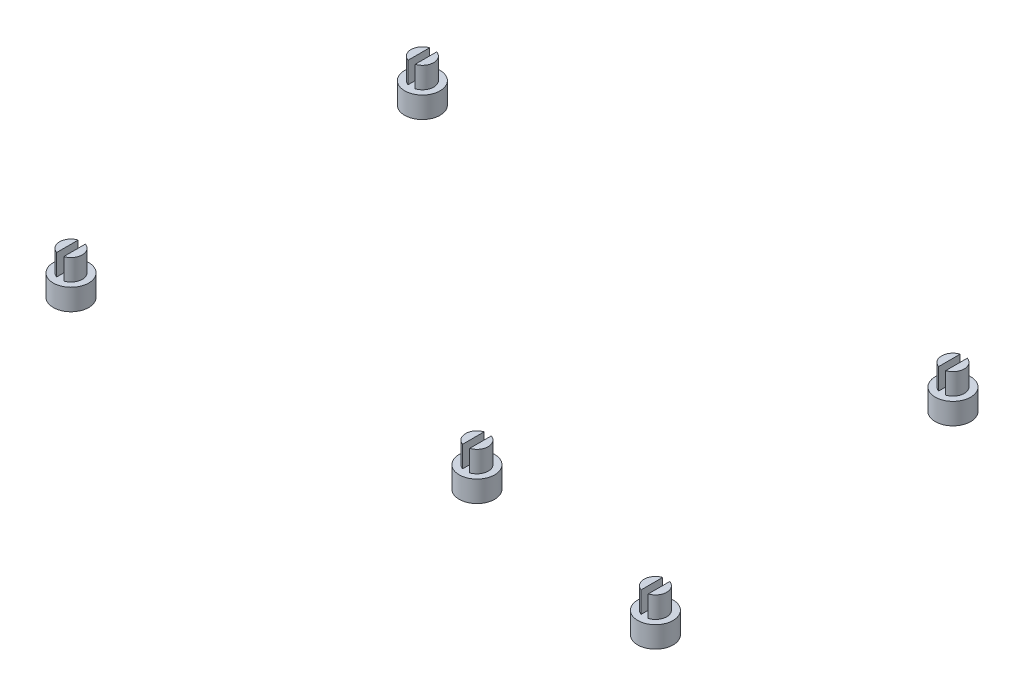
ISO-10303-21;
HEADER;
FILE_DESCRIPTION(('STEP AP214'),'2;1');
FILE_NAME('part.step','',(''),(''),'','','');
FILE_SCHEMA(('AUTOMOTIVE_DESIGN { 1 0 10303 214 1 1 1 1 }'));
ENDSEC;
DATA;
#1=APPLICATION_CONTEXT('core data for automotive mechanical design processes');
#2=APPLICATION_PROTOCOL_DEFINITION('international standard','automotive_design',2000,#1);
#3=PRODUCT_CONTEXT('',#1,'mechanical');
#4=PRODUCT('Part','Part','',(#3));
#5=PRODUCT_RELATED_PRODUCT_CATEGORY('part','',(#4));
#6=PRODUCT_DEFINITION_FORMATION('','',#4);
#7=PRODUCT_DEFINITION_CONTEXT('part definition',#1,'design');
#8=PRODUCT_DEFINITION('design','',#6,#7);
#9=PRODUCT_DEFINITION_SHAPE('','',#8);
#10=(LENGTH_UNIT() NAMED_UNIT(*) SI_UNIT(.MILLI.,.METRE.));
#11=(NAMED_UNIT(*) PLANE_ANGLE_UNIT() SI_UNIT($,.RADIAN.));
#12=(NAMED_UNIT(*) SI_UNIT($,.STERADIAN.) SOLID_ANGLE_UNIT());
#13=UNCERTAINTY_MEASURE_WITH_UNIT(LENGTH_MEASURE(1.E-05),#10,'distance_accuracy_value','');
#14=(GEOMETRIC_REPRESENTATION_CONTEXT(3) GLOBAL_UNCERTAINTY_ASSIGNED_CONTEXT((#13)) GLOBAL_UNIT_ASSIGNED_CONTEXT((#10,
#11,#12)) REPRESENTATION_CONTEXT('',''));
#15=CARTESIAN_POINT('',(0.,0.,0.));
#16=DIRECTION('',(0.,0.,1.));
#17=DIRECTION('',(1.,0.,0.));
#18=AXIS2_PLACEMENT_3D('',#15,#16,#17);
#19=CARTESIAN_POINT('',(-18.9293474696962,28.0298730206955,63.6915116533311));
#20=DIRECTION('',(0.,1.,0.));
#21=DIRECTION('',(0.,0.,1.));
#22=AXIS2_PLACEMENT_3D('',#19,#20,#21);
#23=PLANE('',#22);
#24=CARTESIAN_POINT('',(-18.9293474696962,28.0298730206955,63.6915116533311));
#25=DIRECTION('',(0.,1.,0.));
#26=DIRECTION('',(0.,0.,1.));
#27=AXIS2_PLACEMENT_3D('',#24,#25,#26);
#28=CIRCLE('',#27,2.5);
#29=CARTESIAN_POINT('',(-18.9293474696962,28.0298730206955,66.1915116533311));
#30=VERTEX_POINT('',#29);
#31=EDGE_CURVE('E59',#30,#30,#28,.T.);
#32=ORIENTED_EDGE('',*,*,#31,.T.);
#33=EDGE_LOOP('',(#32));
#34=FACE_BOUND('',#33,.T.);
#35=DIRECTION('',(0.,0.,-1.));
#36=VECTOR('',#35,1.);
#37=CARTESIAN_POINT('',(-18.4293474696962,28.0298730206955,15.3915116533311));
#38=LINE('',#37,#36);
#39=CARTESIAN_POINT('',(-18.4293474696962,28.0298730206955,65.2113800686881));
#40=VERTEX_POINT('',#39);
#41=CARTESIAN_POINT('',(-18.4293474696962,28.0298730206955,62.171643237974));
#42=VERTEX_POINT('',#41);
#43=EDGE_CURVE('E77',#40,#42,#38,.T.);
#44=ORIENTED_EDGE('',*,*,#43,.T.);
#45=CARTESIAN_POINT('',(-18.9293474696962,28.0298730206955,63.6915116533311));
#46=DIRECTION('',(0.,1.,0.));
#47=DIRECTION('',(0.,0.,1.));
#48=AXIS2_PLACEMENT_3D('',#45,#46,#47);
#49=CIRCLE('',#48,1.6);
#50=EDGE_CURVE('E111',#40,#42,#49,.T.);
#51=ORIENTED_EDGE('',*,*,#50,.F.);
#52=EDGE_LOOP('',(#44,#51));
#53=FACE_BOUND('',#52,.T.);
#54=DIRECTION('',(0.,0.,-1.));
#55=VECTOR('',#54,1.);
#56=CARTESIAN_POINT('',(-19.4293474696962,28.0298730206955,15.3915116533311));
#57=LINE('',#56,#55);
#58=CARTESIAN_POINT('',(-19.4293474696962,28.0298730206955,65.2113800686881));
#59=VERTEX_POINT('',#58);
#60=CARTESIAN_POINT('',(-19.4293474696962,28.0298730206955,62.171643237974));
#61=VERTEX_POINT('',#60);
#62=EDGE_CURVE('E108',#59,#61,#57,.T.);
#63=ORIENTED_EDGE('',*,*,#62,.F.);
#64=CARTESIAN_POINT('',(-18.9293474696962,28.0298730206955,63.6915116533311));
#65=DIRECTION('',(0.,1.,0.));
#66=DIRECTION('',(0.,0.,1.));
#67=AXIS2_PLACEMENT_3D('',#64,#65,#66);
#68=CIRCLE('',#67,1.6);
#69=EDGE_CURVE('E70',#61,#59,#68,.T.);
#70=ORIENTED_EDGE('',*,*,#69,.F.);
#71=EDGE_LOOP('',(#63,#70));
#72=FACE_BOUND('',#71,.T.);
#73=ADVANCED_FACE('F56',(#34,#53,#72),#23,.T.);
#74=CARTESIAN_POINT('',(-18.9293474696962,28.0298730206955,63.6915116533311));
#75=DIRECTION('',(0.,-1.,0.));
#76=DIRECTION('',(0.,0.,-1.));
#77=AXIS2_PLACEMENT_3D('',#74,#75,#76);
#78=CYLINDRICAL_SURFACE('',#77,2.5);
#79=ORIENTED_EDGE('',*,*,#31,.F.);
#80=EDGE_LOOP('',(#79));
#81=FACE_BOUND('',#80,.T.);
#82=CARTESIAN_POINT('',(-18.9293474696962,25.0298730206955,63.6915116533311));
#83=DIRECTION('',(0.,1.,0.));
#84=DIRECTION('',(0.,0.,1.));
#85=AXIS2_PLACEMENT_3D('',#82,#83,#84);
#86=CIRCLE('',#85,2.5);
#87=CARTESIAN_POINT('',(-18.9293474696962,25.0298730206955,66.1915116533311));
#88=VERTEX_POINT('',#87);
#89=EDGE_CURVE('E12',#88,#88,#86,.T.);
#90=ORIENTED_EDGE('',*,*,#89,.T.);
#91=EDGE_LOOP('',(#90));
#92=FACE_BOUND('',#91,.T.);
#93=ADVANCED_FACE('F134',(#81,#92),#78,.T.);
#94=CARTESIAN_POINT('',(-18.9293474696962,25.0298730206955,63.6915116533311));
#95=DIRECTION('',(0.,1.,0.));
#96=DIRECTION('',(0.,0.,1.));
#97=AXIS2_PLACEMENT_3D('',#94,#95,#96);
#98=PLANE('',#97);
#99=ORIENTED_EDGE('',*,*,#89,.F.);
#100=EDGE_LOOP('',(#99));
#101=FACE_BOUND('',#100,.T.);
#102=ADVANCED_FACE('F137',(#101),#98,.F.);
#103=CARTESIAN_POINT('',(-18.9293474696962,31.0298730206955,63.6915116533311));
#104=DIRECTION('',(0.,-1.,0.));
#105=DIRECTION('',(0.,0.,-1.));
#106=AXIS2_PLACEMENT_3D('',#103,#104,#105);
#107=CYLINDRICAL_SURFACE('',#106,1.6);
#108=ORIENTED_EDGE('',*,*,#50,.T.);
#109=DIRECTION('',(0.,-1.,0.));
#110=VECTOR('',#109,1.);
#111=CARTESIAN_POINT('',(-18.4293474696962,31.0298730206955,62.171643237974));
#112=LINE('',#111,#110);
#113=CARTESIAN_POINT('',(-18.4293474696962,31.0298730206955,62.171643237974));
#114=VERTEX_POINT('',#113);
#115=EDGE_CURVE('E127',#114,#42,#112,.T.);
#116=ORIENTED_EDGE('',*,*,#115,.F.);
#117=CARTESIAN_POINT('',(-18.9293474696962,31.0298730206955,63.6915116533311));
#118=DIRECTION('',(0.,1.,0.));
#119=DIRECTION('',(0.,0.,1.));
#120=AXIS2_PLACEMENT_3D('',#117,#118,#119);
#121=CIRCLE('',#120,1.6);
#122=CARTESIAN_POINT('',(-18.4293474696962,31.0298730206955,65.2113800686881));
#123=VERTEX_POINT('',#122);
#124=EDGE_CURVE('E118',#123,#114,#121,.T.);
#125=ORIENTED_EDGE('',*,*,#124,.F.);
#126=DIRECTION('',(0.,-1.,0.));
#127=VECTOR('',#126,1.);
#128=CARTESIAN_POINT('',(-18.4293474696962,31.0298730206955,65.2113800686881));
#129=LINE('',#128,#127);
#130=EDGE_CURVE('E122',#123,#40,#129,.T.);
#131=ORIENTED_EDGE('',*,*,#130,.T.);
#132=EDGE_LOOP('',(#108,#116,#125,#131));
#133=FACE_BOUND('',#132,.T.);
#134=ADVANCED_FACE('F142',(#133),#107,.T.);
#135=CARTESIAN_POINT('',(-18.4293474696962,31.0298730206955,15.3915116533311));
#136=DIRECTION('',(-1.,0.,0.));
#137=DIRECTION('',(0.,0.,1.));
#138=AXIS2_PLACEMENT_3D('',#135,#136,#137);
#139=PLANE('',#138);
#140=ORIENTED_EDGE('',*,*,#43,.F.);
#141=ORIENTED_EDGE('',*,*,#130,.F.);
#142=DIRECTION('',(0.,0.,-1.));
#143=VECTOR('',#142,1.);
#144=CARTESIAN_POINT('',(-18.4293474696962,31.0298730206955,15.3915116533311));
#145=LINE('',#144,#143);
#146=EDGE_CURVE('E120',#123,#114,#145,.T.);
#147=ORIENTED_EDGE('',*,*,#146,.T.);
#148=ORIENTED_EDGE('',*,*,#115,.T.);
#149=EDGE_LOOP('',(#140,#141,#147,#148));
#150=FACE_BOUND('',#149,.T.);
#151=ADVANCED_FACE('F147',(#150),#139,.T.);
#152=CARTESIAN_POINT('',(-18.9293474696962,31.0298730206955,63.6915116533311));
#153=DIRECTION('',(0.,1.,0.));
#154=DIRECTION('',(0.,0.,1.));
#155=AXIS2_PLACEMENT_3D('',#152,#153,#154);
#156=PLANE('',#155);
#157=ORIENTED_EDGE('',*,*,#124,.T.);
#158=ORIENTED_EDGE('',*,*,#146,.F.);
#159=EDGE_LOOP('',(#157,#158));
#160=FACE_BOUND('',#159,.T.);
#161=ADVANCED_FACE('F164',(#160),#156,.T.);
#162=CARTESIAN_POINT('',(-18.9293474696962,31.0298730206955,63.6915116533311));
#163=DIRECTION('',(0.,-1.,0.));
#164=DIRECTION('',(0.,0.,-1.));
#165=AXIS2_PLACEMENT_3D('',#162,#163,#164);
#166=CYLINDRICAL_SURFACE('',#165,1.6);
#167=ORIENTED_EDGE('',*,*,#69,.T.);
#168=DIRECTION('',(0.,-1.,0.));
#169=VECTOR('',#168,1.);
#170=CARTESIAN_POINT('',(-19.4293474696962,31.0298730206955,65.2113800686881));
#171=LINE('',#170,#169);
#172=CARTESIAN_POINT('',(-19.4293474696962,31.0298730206955,65.2113800686881));
#173=VERTEX_POINT('',#172);
#174=EDGE_CURVE('E100',#173,#59,#171,.T.);
#175=ORIENTED_EDGE('',*,*,#174,.F.);
#176=CARTESIAN_POINT('',(-18.9293474696962,31.0298730206955,63.6915116533311));
#177=DIRECTION('',(0.,1.,0.));
#178=DIRECTION('',(0.,0.,1.));
#179=AXIS2_PLACEMENT_3D('',#176,#177,#178);
#180=CIRCLE('',#179,1.6);
#181=CARTESIAN_POINT('',(-19.4293474696962,31.0298730206955,62.171643237974));
#182=VERTEX_POINT('',#181);
#183=EDGE_CURVE('E105',#182,#173,#180,.T.);
#184=ORIENTED_EDGE('',*,*,#183,.F.);
#185=DIRECTION('',(0.,-1.,0.));
#186=VECTOR('',#185,1.);
#187=CARTESIAN_POINT('',(-19.4293474696962,31.0298730206955,62.171643237974));
#188=LINE('',#187,#186);
#189=EDGE_CURVE('E102',#182,#61,#188,.T.);
#190=ORIENTED_EDGE('',*,*,#189,.T.);
#191=EDGE_LOOP('',(#167,#175,#184,#190));
#192=FACE_BOUND('',#191,.T.);
#193=ADVANCED_FACE('F110',(#192),#166,.T.);
#194=CARTESIAN_POINT('',(-19.4293474696962,31.0298730206955,15.3915116533311));
#195=DIRECTION('',(-1.,0.,0.));
#196=DIRECTION('',(0.,0.,1.));
#197=AXIS2_PLACEMENT_3D('',#194,#195,#196);
#198=PLANE('',#197);
#199=ORIENTED_EDGE('',*,*,#62,.T.);
#200=ORIENTED_EDGE('',*,*,#189,.F.);
#201=DIRECTION('',(0.,0.,-1.));
#202=VECTOR('',#201,1.);
#203=CARTESIAN_POINT('',(-19.4293474696962,31.0298730206955,15.3915116533311));
#204=LINE('',#203,#202);
#205=EDGE_CURVE('E97',#173,#182,#204,.T.);
#206=ORIENTED_EDGE('',*,*,#205,.F.);
#207=ORIENTED_EDGE('',*,*,#174,.T.);
#208=EDGE_LOOP('',(#199,#200,#206,#207));
#209=FACE_BOUND('',#208,.T.);
#210=ADVANCED_FACE('F99',(#209),#198,.F.);
#211=CARTESIAN_POINT('',(-18.9293474696962,31.0298730206955,63.6915116533311));
#212=DIRECTION('',(0.,1.,0.));
#213=DIRECTION('',(0.,0.,1.));
#214=AXIS2_PLACEMENT_3D('',#211,#212,#213);
#215=PLANE('',#214);
#216=ORIENTED_EDGE('',*,*,#183,.T.);
#217=ORIENTED_EDGE('',*,*,#205,.T.);
#218=EDGE_LOOP('',(#216,#217));
#219=FACE_BOUND('',#218,.T.);
#220=ADVANCED_FACE('F107',(#219),#215,.T.);
#221=CLOSED_SHELL('',(#73,#93,#102,#134,#151,#161,#193,#210,#220));
#222=MANIFOLD_SOLID_BREP('B2',#221);
#223=CARTESIAN_POINT('',(33.1706525303038,28.0298730206955,58.4915116533311));
#224=DIRECTION('',(0.,1.,0.));
#225=DIRECTION('',(0.,0.,1.));
#226=AXIS2_PLACEMENT_3D('',#223,#224,#225);
#227=PLANE('',#226);
#228=CARTESIAN_POINT('',(33.1706525303038,28.0298730206955,58.4915116533311));
#229=DIRECTION('',(0.,1.,0.));
#230=DIRECTION('',(0.,0.,1.));
#231=AXIS2_PLACEMENT_3D('',#228,#229,#230);
#232=CIRCLE('',#231,2.5);
#233=CARTESIAN_POINT('',(33.1706525303038,28.0298730206955,60.9915116533311));
#234=VERTEX_POINT('',#233);
#235=EDGE_CURVE('E234',#234,#234,#232,.T.);
#236=ORIENTED_EDGE('',*,*,#235,.T.);
#237=EDGE_LOOP('',(#236));
#238=FACE_BOUND('',#237,.T.);
#239=DIRECTION('',(0.,0.,-1.));
#240=VECTOR('',#239,1.);
#241=CARTESIAN_POINT('',(33.6706525303038,28.0298730206955,15.3915116533311));
#242=LINE('',#241,#240);
#243=CARTESIAN_POINT('',(33.6706525303038,28.0298730206955,60.0113800686881));
#244=VERTEX_POINT('',#243);
#245=CARTESIAN_POINT('',(33.6706525303038,28.0298730206955,56.971643237974));
#246=VERTEX_POINT('',#245);
#247=EDGE_CURVE('E252',#244,#246,#242,.T.);
#248=ORIENTED_EDGE('',*,*,#247,.T.);
#249=CARTESIAN_POINT('',(33.1706525303038,28.0298730206955,58.4915116533311));
#250=DIRECTION('',(0.,1.,0.));
#251=DIRECTION('',(0.,0.,1.));
#252=AXIS2_PLACEMENT_3D('',#249,#250,#251);
#253=CIRCLE('',#252,1.6);
#254=EDGE_CURVE('E286',#244,#246,#253,.T.);
#255=ORIENTED_EDGE('',*,*,#254,.F.);
#256=EDGE_LOOP('',(#248,#255));
#257=FACE_BOUND('',#256,.T.);
#258=DIRECTION('',(0.,0.,-1.));
#259=VECTOR('',#258,1.);
#260=CARTESIAN_POINT('',(32.6706525303038,28.0298730206955,15.3915116533311));
#261=LINE('',#260,#259);
#262=CARTESIAN_POINT('',(32.6706525303038,28.0298730206955,60.0113800686881));
#263=VERTEX_POINT('',#262);
#264=CARTESIAN_POINT('',(32.6706525303038,28.0298730206955,56.971643237974));
#265=VERTEX_POINT('',#264);
#266=EDGE_CURVE('E283',#263,#265,#261,.T.);
#267=ORIENTED_EDGE('',*,*,#266,.F.);
#268=CARTESIAN_POINT('',(33.1706525303038,28.0298730206955,58.4915116533311));
#269=DIRECTION('',(0.,1.,0.));
#270=DIRECTION('',(0.,0.,1.));
#271=AXIS2_PLACEMENT_3D('',#268,#269,#270);
#272=CIRCLE('',#271,1.6);
#273=EDGE_CURVE('E245',#265,#263,#272,.T.);
#274=ORIENTED_EDGE('',*,*,#273,.F.);
#275=EDGE_LOOP('',(#267,#274));
#276=FACE_BOUND('',#275,.T.);
#277=ADVANCED_FACE('F231',(#238,#257,#276),#227,.T.);
#278=CARTESIAN_POINT('',(33.1706525303038,28.0298730206955,58.4915116533311));
#279=DIRECTION('',(0.,-1.,0.));
#280=DIRECTION('',(0.,0.,-1.));
#281=AXIS2_PLACEMENT_3D('',#278,#279,#280);
#282=CYLINDRICAL_SURFACE('',#281,2.5);
#283=ORIENTED_EDGE('',*,*,#235,.F.);
#284=EDGE_LOOP('',(#283));
#285=FACE_BOUND('',#284,.T.);
#286=CARTESIAN_POINT('',(33.1706525303038,25.0298730206955,58.4915116533311));
#287=DIRECTION('',(0.,1.,0.));
#288=DIRECTION('',(0.,0.,1.));
#289=AXIS2_PLACEMENT_3D('',#286,#287,#288);
#290=CIRCLE('',#289,2.5);
#291=CARTESIAN_POINT('',(33.1706525303038,25.0298730206955,60.9915116533311));
#292=VERTEX_POINT('',#291);
#293=EDGE_CURVE('E54',#292,#292,#290,.T.);
#294=ORIENTED_EDGE('',*,*,#293,.T.);
#295=EDGE_LOOP('',(#294));
#296=FACE_BOUND('',#295,.T.);
#297=ADVANCED_FACE('F309',(#285,#296),#282,.T.);
#298=CARTESIAN_POINT('',(33.1706525303038,25.0298730206955,58.4915116533311));
#299=DIRECTION('',(0.,1.,0.));
#300=DIRECTION('',(0.,0.,1.));
#301=AXIS2_PLACEMENT_3D('',#298,#299,#300);
#302=PLANE('',#301);
#303=ORIENTED_EDGE('',*,*,#293,.F.);
#304=EDGE_LOOP('',(#303));
#305=FACE_BOUND('',#304,.T.);
#306=ADVANCED_FACE('F312',(#305),#302,.F.);
#307=CARTESIAN_POINT('',(33.1706525303038,31.0298730206955,58.4915116533311));
#308=DIRECTION('',(0.,-1.,0.));
#309=DIRECTION('',(0.,0.,-1.));
#310=AXIS2_PLACEMENT_3D('',#307,#308,#309);
#311=CYLINDRICAL_SURFACE('',#310,1.6);
#312=ORIENTED_EDGE('',*,*,#254,.T.);
#313=DIRECTION('',(0.,-1.,0.));
#314=VECTOR('',#313,1.);
#315=CARTESIAN_POINT('',(33.6706525303038,31.0298730206955,56.971643237974));
#316=LINE('',#315,#314);
#317=CARTESIAN_POINT('',(33.6706525303038,31.0298730206955,56.971643237974));
#318=VERTEX_POINT('',#317);
#319=EDGE_CURVE('E302',#318,#246,#316,.T.);
#320=ORIENTED_EDGE('',*,*,#319,.F.);
#321=CARTESIAN_POINT('',(33.1706525303038,31.0298730206955,58.4915116533311));
#322=DIRECTION('',(0.,1.,0.));
#323=DIRECTION('',(0.,0.,1.));
#324=AXIS2_PLACEMENT_3D('',#321,#322,#323);
#325=CIRCLE('',#324,1.6);
#326=CARTESIAN_POINT('',(33.6706525303038,31.0298730206955,60.0113800686881));
#327=VERTEX_POINT('',#326);
#328=EDGE_CURVE('E293',#327,#318,#325,.T.);
#329=ORIENTED_EDGE('',*,*,#328,.F.);
#330=DIRECTION('',(0.,-1.,0.));
#331=VECTOR('',#330,1.);
#332=CARTESIAN_POINT('',(33.6706525303038,31.0298730206955,60.0113800686881));
#333=LINE('',#332,#331);
#334=EDGE_CURVE('E297',#327,#244,#333,.T.);
#335=ORIENTED_EDGE('',*,*,#334,.T.);
#336=EDGE_LOOP('',(#312,#320,#329,#335));
#337=FACE_BOUND('',#336,.T.);
#338=ADVANCED_FACE('F317',(#337),#311,.T.);
#339=CARTESIAN_POINT('',(33.6706525303038,31.0298730206955,15.3915116533311));
#340=DIRECTION('',(-1.,0.,0.));
#341=DIRECTION('',(0.,0.,1.));
#342=AXIS2_PLACEMENT_3D('',#339,#340,#341);
#343=PLANE('',#342);
#344=ORIENTED_EDGE('',*,*,#247,.F.);
#345=ORIENTED_EDGE('',*,*,#334,.F.);
#346=DIRECTION('',(0.,0.,-1.));
#347=VECTOR('',#346,1.);
#348=CARTESIAN_POINT('',(33.6706525303038,31.0298730206955,15.3915116533311));
#349=LINE('',#348,#347);
#350=EDGE_CURVE('E295',#327,#318,#349,.T.);
#351=ORIENTED_EDGE('',*,*,#350,.T.);
#352=ORIENTED_EDGE('',*,*,#319,.T.);
#353=EDGE_LOOP('',(#344,#345,#351,#352));
#354=FACE_BOUND('',#353,.T.);
#355=ADVANCED_FACE('F322',(#354),#343,.T.);
#356=CARTESIAN_POINT('',(33.1706525303038,31.0298730206955,58.4915116533311));
#357=DIRECTION('',(0.,1.,0.));
#358=DIRECTION('',(0.,0.,1.));
#359=AXIS2_PLACEMENT_3D('',#356,#357,#358);
#360=PLANE('',#359);
#361=ORIENTED_EDGE('',*,*,#328,.T.);
#362=ORIENTED_EDGE('',*,*,#350,.F.);
#363=EDGE_LOOP('',(#361,#362));
#364=FACE_BOUND('',#363,.T.);
#365=ADVANCED_FACE('F339',(#364),#360,.T.);
#366=CARTESIAN_POINT('',(33.1706525303038,31.0298730206955,58.4915116533311));
#367=DIRECTION('',(0.,-1.,0.));
#368=DIRECTION('',(0.,0.,-1.));
#369=AXIS2_PLACEMENT_3D('',#366,#367,#368);
#370=CYLINDRICAL_SURFACE('',#369,1.6);
#371=ORIENTED_EDGE('',*,*,#273,.T.);
#372=DIRECTION('',(0.,-1.,0.));
#373=VECTOR('',#372,1.);
#374=CARTESIAN_POINT('',(32.6706525303038,31.0298730206955,60.0113800686881));
#375=LINE('',#374,#373);
#376=CARTESIAN_POINT('',(32.6706525303038,31.0298730206955,60.0113800686881));
#377=VERTEX_POINT('',#376);
#378=EDGE_CURVE('E275',#377,#263,#375,.T.);
#379=ORIENTED_EDGE('',*,*,#378,.F.);
#380=CARTESIAN_POINT('',(33.1706525303038,31.0298730206955,58.4915116533311));
#381=DIRECTION('',(0.,1.,0.));
#382=DIRECTION('',(0.,0.,1.));
#383=AXIS2_PLACEMENT_3D('',#380,#381,#382);
#384=CIRCLE('',#383,1.6);
#385=CARTESIAN_POINT('',(32.6706525303038,31.0298730206955,56.971643237974));
#386=VERTEX_POINT('',#385);
#387=EDGE_CURVE('E280',#386,#377,#384,.T.);
#388=ORIENTED_EDGE('',*,*,#387,.F.);
#389=DIRECTION('',(0.,-1.,0.));
#390=VECTOR('',#389,1.);
#391=CARTESIAN_POINT('',(32.6706525303038,31.0298730206955,56.971643237974));
#392=LINE('',#391,#390);
#393=EDGE_CURVE('E277',#386,#265,#392,.T.);
#394=ORIENTED_EDGE('',*,*,#393,.T.);
#395=EDGE_LOOP('',(#371,#379,#388,#394));
#396=FACE_BOUND('',#395,.T.);
#397=ADVANCED_FACE('F285',(#396),#370,.T.);
#398=CARTESIAN_POINT('',(32.6706525303038,31.0298730206955,15.3915116533311));
#399=DIRECTION('',(-1.,0.,0.));
#400=DIRECTION('',(0.,0.,1.));
#401=AXIS2_PLACEMENT_3D('',#398,#399,#400);
#402=PLANE('',#401);
#403=ORIENTED_EDGE('',*,*,#266,.T.);
#404=ORIENTED_EDGE('',*,*,#393,.F.);
#405=DIRECTION('',(0.,0.,-1.));
#406=VECTOR('',#405,1.);
#407=CARTESIAN_POINT('',(32.6706525303038,31.0298730206955,15.3915116533311));
#408=LINE('',#407,#406);
#409=EDGE_CURVE('E272',#377,#386,#408,.T.);
#410=ORIENTED_EDGE('',*,*,#409,.F.);
#411=ORIENTED_EDGE('',*,*,#378,.T.);
#412=EDGE_LOOP('',(#403,#404,#410,#411));
#413=FACE_BOUND('',#412,.T.);
#414=ADVANCED_FACE('F274',(#413),#402,.F.);
#415=CARTESIAN_POINT('',(33.1706525303038,31.0298730206955,58.4915116533311));
#416=DIRECTION('',(0.,1.,0.));
#417=DIRECTION('',(0.,0.,1.));
#418=AXIS2_PLACEMENT_3D('',#415,#416,#417);
#419=PLANE('',#418);
#420=ORIENTED_EDGE('',*,*,#387,.T.);
#421=ORIENTED_EDGE('',*,*,#409,.T.);
#422=EDGE_LOOP('',(#420,#421));
#423=FACE_BOUND('',#422,.T.);
#424=ADVANCED_FACE('F282',(#423),#419,.T.);
#425=CLOSED_SHELL('',(#277,#297,#306,#338,#355,#365,#397,#414,#424));
#426=MANIFOLD_SOLID_BREP('B6',#425);
#427=CARTESIAN_POINT('',(63.5706525303038,28.0298730206955,63.6915116533311));
#428=DIRECTION('',(0.,1.,0.));
#429=DIRECTION('',(0.,0.,1.));
#430=AXIS2_PLACEMENT_3D('',#427,#428,#429);
#431=PLANE('',#430);
#432=CARTESIAN_POINT('',(63.5706525303038,28.0298730206955,63.6915116533311));
#433=DIRECTION('',(0.,1.,0.));
#434=DIRECTION('',(0.,0.,1.));
#435=AXIS2_PLACEMENT_3D('',#432,#433,#434);
#436=CIRCLE('',#435,2.50000000000001);
#437=CARTESIAN_POINT('',(63.5706525303038,28.0298730206955,66.1915116533311));
#438=VERTEX_POINT('',#437);
#439=EDGE_CURVE('E409',#438,#438,#436,.T.);
#440=ORIENTED_EDGE('',*,*,#439,.T.);
#441=EDGE_LOOP('',(#440));
#442=FACE_BOUND('',#441,.T.);
#443=DIRECTION('',(0.,0.,-1.));
#444=VECTOR('',#443,1.);
#445=CARTESIAN_POINT('',(64.0706525303037,28.0298730206955,15.3915116533311));
#446=LINE('',#445,#444);
#447=CARTESIAN_POINT('',(64.0706525303037,28.0298730206955,65.2113800686881));
#448=VERTEX_POINT('',#447);
#449=CARTESIAN_POINT('',(64.0706525303037,28.0298730206955,62.171643237974));
#450=VERTEX_POINT('',#449);
#451=EDGE_CURVE('E428',#448,#450,#446,.T.);
#452=ORIENTED_EDGE('',*,*,#451,.T.);
#453=CARTESIAN_POINT('',(63.5706525303038,28.0298730206955,63.6915116533311));
#454=DIRECTION('',(0.,1.,0.));
#455=DIRECTION('',(0.,0.,1.));
#456=AXIS2_PLACEMENT_3D('',#453,#454,#455);
#457=CIRCLE('',#456,1.60000000000001);
#458=EDGE_CURVE('E465',#448,#450,#457,.T.);
#459=ORIENTED_EDGE('',*,*,#458,.F.);
#460=EDGE_LOOP('',(#452,#459));
#461=FACE_BOUND('',#460,.T.);
#462=DIRECTION('',(0.,0.,-1.));
#463=VECTOR('',#462,1.);
#464=CARTESIAN_POINT('',(63.0706525303037,28.0298730206955,15.3915116533311));
#465=LINE('',#464,#463);
#466=CARTESIAN_POINT('',(63.0706525303037,28.0298730206955,65.2113800686881));
#467=VERTEX_POINT('',#466);
#468=CARTESIAN_POINT('',(63.0706525303037,28.0298730206955,62.171643237974));
#469=VERTEX_POINT('',#468);
#470=EDGE_CURVE('E461',#467,#469,#465,.T.);
#471=ORIENTED_EDGE('',*,*,#470,.F.);
#472=CARTESIAN_POINT('',(63.5706525303038,28.0298730206955,63.6915116533311));
#473=DIRECTION('',(0.,1.,0.));
#474=DIRECTION('',(0.,0.,1.));
#475=AXIS2_PLACEMENT_3D('',#472,#473,#474);
#476=CIRCLE('',#475,1.60000000000001);
#477=EDGE_CURVE('E421',#469,#467,#476,.T.);
#478=ORIENTED_EDGE('',*,*,#477,.F.);
#479=EDGE_LOOP('',(#471,#478));
#480=FACE_BOUND('',#479,.T.);
#481=ADVANCED_FACE('F406',(#442,#461,#480),#431,.T.);
#482=CARTESIAN_POINT('',(63.5706525303038,28.0298730206955,63.6915116533311));
#483=DIRECTION('',(0.,-1.,0.));
#484=DIRECTION('',(0.,0.,-1.));
#485=AXIS2_PLACEMENT_3D('',#482,#483,#484);
#486=CYLINDRICAL_SURFACE('',#485,2.50000000000001);
#487=ORIENTED_EDGE('',*,*,#439,.F.);
#488=EDGE_LOOP('',(#487));
#489=FACE_BOUND('',#488,.T.);
#490=CARTESIAN_POINT('',(63.5706525303038,25.0298730206955,63.6915116533311));
#491=DIRECTION('',(0.,1.,0.));
#492=DIRECTION('',(0.,0.,1.));
#493=AXIS2_PLACEMENT_3D('',#490,#491,#492);
#494=CIRCLE('',#493,2.50000000000001);
#495=CARTESIAN_POINT('',(63.5706525303038,25.0298730206955,66.1915116533311));
#496=VERTEX_POINT('',#495);
#497=EDGE_CURVE('E229',#496,#496,#494,.T.);
#498=ORIENTED_EDGE('',*,*,#497,.T.);
#499=EDGE_LOOP('',(#498));
#500=FACE_BOUND('',#499,.T.);
#501=ADVANCED_FACE('F496',(#489,#500),#486,.T.);
#502=CARTESIAN_POINT('',(63.5706525303038,25.0298730206955,63.6915116533311));
#503=DIRECTION('',(0.,1.,0.));
#504=DIRECTION('',(0.,0.,1.));
#505=AXIS2_PLACEMENT_3D('',#502,#503,#504);
#506=PLANE('',#505);
#507=ORIENTED_EDGE('',*,*,#497,.F.);
#508=EDGE_LOOP('',(#507));
#509=FACE_BOUND('',#508,.T.);
#510=ADVANCED_FACE('F499',(#509),#506,.F.);
#511=CARTESIAN_POINT('',(63.5706525303038,31.0298730206955,63.6915116533311));
#512=DIRECTION('',(0.,-1.,0.));
#513=DIRECTION('',(0.,0.,-1.));
#514=AXIS2_PLACEMENT_3D('',#511,#512,#513);
#515=CYLINDRICAL_SURFACE('',#514,1.60000000000001);
#516=ORIENTED_EDGE('',*,*,#458,.T.);
#517=DIRECTION('',(0.,-1.,0.));
#518=VECTOR('',#517,1.);
#519=CARTESIAN_POINT('',(64.0706525303037,31.0298730206955,62.171643237974));
#520=LINE('',#519,#518);
#521=CARTESIAN_POINT('',(64.0706525303037,31.0298730206955,62.171643237974));
#522=VERTEX_POINT('',#521);
#523=EDGE_CURVE('E487',#522,#450,#520,.T.);
#524=ORIENTED_EDGE('',*,*,#523,.F.);
#525=CARTESIAN_POINT('',(63.5706525303038,31.0298730206955,63.6915116533311));
#526=DIRECTION('',(0.,1.,0.));
#527=DIRECTION('',(0.,0.,1.));
#528=AXIS2_PLACEMENT_3D('',#525,#526,#527);
#529=CIRCLE('',#528,1.60000000000001);
#530=CARTESIAN_POINT('',(64.0706525303037,31.0298730206955,65.2113800686881));
#531=VERTEX_POINT('',#530);
#532=EDGE_CURVE('E474',#531,#522,#529,.T.);
#533=ORIENTED_EDGE('',*,*,#532,.F.);
#534=DIRECTION('',(0.,-1.,0.));
#535=VECTOR('',#534,1.);
#536=CARTESIAN_POINT('',(64.0706525303037,31.0298730206955,65.2113800686881));
#537=LINE('',#536,#535);
#538=EDGE_CURVE('E480',#531,#448,#537,.T.);
#539=ORIENTED_EDGE('',*,*,#538,.T.);
#540=EDGE_LOOP('',(#516,#524,#533,#539));
#541=FACE_BOUND('',#540,.T.);
#542=ADVANCED_FACE('F504',(#541),#515,.T.);
#543=CARTESIAN_POINT('',(64.0706525303037,31.0298730206955,15.3915116533311));
#544=DIRECTION('',(-1.,0.,0.));
#545=DIRECTION('',(0.,0.,1.));
#546=AXIS2_PLACEMENT_3D('',#543,#544,#545);
#547=PLANE('',#546);
#548=ORIENTED_EDGE('',*,*,#451,.F.);
#549=ORIENTED_EDGE('',*,*,#538,.F.);
#550=DIRECTION('',(0.,0.,-1.));
#551=VECTOR('',#550,1.);
#552=CARTESIAN_POINT('',(64.0706525303037,31.0298730206955,15.3915116533311));
#553=LINE('',#552,#551);
#554=EDGE_CURVE('E477',#531,#522,#553,.T.);
#555=ORIENTED_EDGE('',*,*,#554,.T.);
#556=ORIENTED_EDGE('',*,*,#523,.T.);
#557=EDGE_LOOP('',(#548,#549,#555,#556));
#558=FACE_BOUND('',#557,.T.);
#559=ADVANCED_FACE('F509',(#558),#547,.T.);
#560=CARTESIAN_POINT('',(63.5706525303038,31.0298730206955,63.6915116533311));
#561=DIRECTION('',(0.,1.,0.));
#562=DIRECTION('',(0.,0.,1.));
#563=AXIS2_PLACEMENT_3D('',#560,#561,#562);
#564=PLANE('',#563);
#565=ORIENTED_EDGE('',*,*,#532,.T.);
#566=ORIENTED_EDGE('',*,*,#554,.F.);
#567=EDGE_LOOP('',(#565,#566));
#568=FACE_BOUND('',#567,.T.);
#569=ADVANCED_FACE('F526',(#568),#564,.T.);
#570=CARTESIAN_POINT('',(63.5706525303038,31.0298730206955,63.6915116533311));
#571=DIRECTION('',(0.,-1.,0.));
#572=DIRECTION('',(0.,0.,-1.));
#573=AXIS2_PLACEMENT_3D('',#570,#571,#572);
#574=CYLINDRICAL_SURFACE('',#573,1.60000000000001);
#575=ORIENTED_EDGE('',*,*,#477,.T.);
#576=DIRECTION('',(0.,-1.,0.));
#577=VECTOR('',#576,1.);
#578=CARTESIAN_POINT('',(63.0706525303037,31.0298730206955,65.2113800686881));
#579=LINE('',#578,#577);
#580=CARTESIAN_POINT('',(63.0706525303037,31.0298730206955,65.2113800686881));
#581=VERTEX_POINT('',#580);
#582=EDGE_CURVE('E451',#581,#467,#579,.T.);
#583=ORIENTED_EDGE('',*,*,#582,.F.);
#584=CARTESIAN_POINT('',(63.5706525303038,31.0298730206955,63.6915116533311));
#585=DIRECTION('',(0.,1.,0.));
#586=DIRECTION('',(0.,0.,1.));
#587=AXIS2_PLACEMENT_3D('',#584,#585,#586);
#588=CIRCLE('',#587,1.60000000000001);
#589=CARTESIAN_POINT('',(63.0706525303037,31.0298730206955,62.171643237974));
#590=VERTEX_POINT('',#589);
#591=EDGE_CURVE('E457',#590,#581,#588,.T.);
#592=ORIENTED_EDGE('',*,*,#591,.F.);
#593=DIRECTION('',(0.,-1.,0.));
#594=VECTOR('',#593,1.);
#595=CARTESIAN_POINT('',(63.0706525303037,31.0298730206955,62.171643237974));
#596=LINE('',#595,#594);
#597=EDGE_CURVE('E453',#590,#469,#596,.T.);
#598=ORIENTED_EDGE('',*,*,#597,.T.);
#599=EDGE_LOOP('',(#575,#583,#592,#598));
#600=FACE_BOUND('',#599,.T.);
#601=ADVANCED_FACE('F463',(#600),#574,.T.);
#602=CARTESIAN_POINT('',(63.0706525303037,31.0298730206955,15.3915116533311));
#603=DIRECTION('',(-1.,0.,0.));
#604=DIRECTION('',(0.,0.,1.));
#605=AXIS2_PLACEMENT_3D('',#602,#603,#604);
#606=PLANE('',#605);
#607=ORIENTED_EDGE('',*,*,#470,.T.);
#608=ORIENTED_EDGE('',*,*,#597,.F.);
#609=DIRECTION('',(0.,0.,-1.));
#610=VECTOR('',#609,1.);
#611=CARTESIAN_POINT('',(63.0706525303037,31.0298730206955,15.3915116533311));
#612=LINE('',#611,#610);
#613=EDGE_CURVE('E448',#581,#590,#612,.T.);
#614=ORIENTED_EDGE('',*,*,#613,.F.);
#615=ORIENTED_EDGE('',*,*,#582,.T.);
#616=EDGE_LOOP('',(#607,#608,#614,#615));
#617=FACE_BOUND('',#616,.T.);
#618=ADVANCED_FACE('F450',(#617),#606,.F.);
#619=CARTESIAN_POINT('',(63.5706525303038,31.0298730206955,63.6915116533311));
#620=DIRECTION('',(0.,1.,0.));
#621=DIRECTION('',(0.,0.,1.));
#622=AXIS2_PLACEMENT_3D('',#619,#620,#621);
#623=PLANE('',#622);
#624=ORIENTED_EDGE('',*,*,#591,.T.);
#625=ORIENTED_EDGE('',*,*,#613,.T.);
#626=EDGE_LOOP('',(#624,#625));
#627=FACE_BOUND('',#626,.T.);
#628=ADVANCED_FACE('F459',(#627),#623,.T.);
#629=CLOSED_SHELL('',(#481,#501,#510,#542,#559,#569,#601,#618,#628));
#630=MANIFOLD_SOLID_BREP('B48',#629);
#631=CARTESIAN_POINT('',(57.2706525303038,28.0298730206955,15.3915116533311));
#632=DIRECTION('',(0.,1.,0.));
#633=DIRECTION('',(0.,0.,1.));
#634=AXIS2_PLACEMENT_3D('',#631,#632,#633);
#635=PLANE('',#634);
#636=CARTESIAN_POINT('',(57.2706525303038,28.0298730206955,15.3915116533311));
#637=DIRECTION('',(0.,1.,0.));
#638=DIRECTION('',(0.,0.,1.));
#639=AXIS2_PLACEMENT_3D('',#636,#637,#638);
#640=CIRCLE('',#639,2.5);
#641=CARTESIAN_POINT('',(57.2706525303038,28.0298730206955,17.8915116533311));
#642=VERTEX_POINT('',#641);
#643=EDGE_CURVE('E597',#642,#642,#640,.T.);
#644=ORIENTED_EDGE('',*,*,#643,.T.);
#645=EDGE_LOOP('',(#644));
#646=FACE_BOUND('',#645,.T.);
#647=DIRECTION('',(0.,0.,-1.));
#648=VECTOR('',#647,1.);
#649=CARTESIAN_POINT('',(57.7706525303038,28.0298730206955,15.3915116533311));
#650=LINE('',#649,#648);
#651=CARTESIAN_POINT('',(57.7706525303038,28.0298730206955,16.9113800686881));
#652=VERTEX_POINT('',#651);
#653=CARTESIAN_POINT('',(57.7706525303038,28.0298730206955,13.871643237974));
#654=VERTEX_POINT('',#653);
#655=EDGE_CURVE('E615',#652,#654,#650,.T.);
#656=ORIENTED_EDGE('',*,*,#655,.T.);
#657=CARTESIAN_POINT('',(57.2706525303038,28.0298730206955,15.3915116533311));
#658=DIRECTION('',(0.,1.,0.));
#659=DIRECTION('',(0.,0.,1.));
#660=AXIS2_PLACEMENT_3D('',#657,#658,#659);
#661=CIRCLE('',#660,1.6);
#662=EDGE_CURVE('E649',#652,#654,#661,.T.);
#663=ORIENTED_EDGE('',*,*,#662,.F.);
#664=EDGE_LOOP('',(#656,#663));
#665=FACE_BOUND('',#664,.T.);
#666=DIRECTION('',(0.,0.,-1.));
#667=VECTOR('',#666,1.);
#668=CARTESIAN_POINT('',(56.7706525303038,28.0298730206955,15.3915116533311));
#669=LINE('',#668,#667);
#670=CARTESIAN_POINT('',(56.7706525303038,28.0298730206955,16.9113800686881));
#671=VERTEX_POINT('',#670);
#672=CARTESIAN_POINT('',(56.7706525303038,28.0298730206955,13.871643237974));
#673=VERTEX_POINT('',#672);
#674=EDGE_CURVE('E646',#671,#673,#669,.T.);
#675=ORIENTED_EDGE('',*,*,#674,.F.);
#676=CARTESIAN_POINT('',(57.2706525303038,28.0298730206955,15.3915116533311));
#677=DIRECTION('',(0.,1.,0.));
#678=DIRECTION('',(0.,0.,1.));
#679=AXIS2_PLACEMENT_3D('',#676,#677,#678);
#680=CIRCLE('',#679,1.6);
#681=EDGE_CURVE('E608',#673,#671,#680,.T.);
#682=ORIENTED_EDGE('',*,*,#681,.F.);
#683=EDGE_LOOP('',(#675,#682));
#684=FACE_BOUND('',#683,.T.);
#685=ADVANCED_FACE('F594',(#646,#665,#684),#635,.T.);
#686=CARTESIAN_POINT('',(57.2706525303038,28.0298730206955,15.3915116533311));
#687=DIRECTION('',(0.,-1.,0.));
#688=DIRECTION('',(0.,0.,-1.));
#689=AXIS2_PLACEMENT_3D('',#686,#687,#688);
#690=CYLINDRICAL_SURFACE('',#689,2.5);
#691=ORIENTED_EDGE('',*,*,#643,.F.);
#692=EDGE_LOOP('',(#691));
#693=FACE_BOUND('',#692,.T.);
#694=CARTESIAN_POINT('',(57.2706525303038,25.0298730206955,15.3915116533311));
#695=DIRECTION('',(0.,1.,0.));
#696=DIRECTION('',(0.,0.,1.));
#697=AXIS2_PLACEMENT_3D('',#694,#695,#696);
#698=CIRCLE('',#697,2.5);
#699=CARTESIAN_POINT('',(57.2706525303038,25.0298730206955,17.8915116533311));
#700=VERTEX_POINT('',#699);
#701=EDGE_CURVE('E404',#700,#700,#698,.T.);
#702=ORIENTED_EDGE('',*,*,#701,.T.);
#703=EDGE_LOOP('',(#702));
#704=FACE_BOUND('',#703,.T.);
#705=ADVANCED_FACE('F672',(#693,#704),#690,.T.);
#706=CARTESIAN_POINT('',(57.2706525303038,25.0298730206955,15.3915116533311));
#707=DIRECTION('',(0.,1.,0.));
#708=DIRECTION('',(0.,0.,1.));
#709=AXIS2_PLACEMENT_3D('',#706,#707,#708);
#710=PLANE('',#709);
#711=ORIENTED_EDGE('',*,*,#701,.F.);
#712=EDGE_LOOP('',(#711));
#713=FACE_BOUND('',#712,.T.);
#714=ADVANCED_FACE('F675',(#713),#710,.F.);
#715=CARTESIAN_POINT('',(57.2706525303038,31.0298730206955,15.3915116533311));
#716=DIRECTION('',(0.,-1.,0.));
#717=DIRECTION('',(0.,0.,-1.));
#718=AXIS2_PLACEMENT_3D('',#715,#716,#717);
#719=CYLINDRICAL_SURFACE('',#718,1.6);
#720=ORIENTED_EDGE('',*,*,#662,.T.);
#721=DIRECTION('',(0.,-1.,0.));
#722=VECTOR('',#721,1.);
#723=CARTESIAN_POINT('',(57.7706525303038,31.0298730206955,13.871643237974));
#724=LINE('',#723,#722);
#725=CARTESIAN_POINT('',(57.7706525303038,31.0298730206955,13.871643237974));
#726=VERTEX_POINT('',#725);
#727=EDGE_CURVE('E665',#726,#654,#724,.T.);
#728=ORIENTED_EDGE('',*,*,#727,.F.);
#729=CARTESIAN_POINT('',(57.2706525303038,31.0298730206955,15.3915116533311));
#730=DIRECTION('',(0.,1.,0.));
#731=DIRECTION('',(0.,0.,1.));
#732=AXIS2_PLACEMENT_3D('',#729,#730,#731);
#733=CIRCLE('',#732,1.6);
#734=CARTESIAN_POINT('',(57.7706525303038,31.0298730206955,16.9113800686881));
#735=VERTEX_POINT('',#734);
#736=EDGE_CURVE('E656',#735,#726,#733,.T.);
#737=ORIENTED_EDGE('',*,*,#736,.F.);
#738=DIRECTION('',(0.,-1.,0.));
#739=VECTOR('',#738,1.);
#740=CARTESIAN_POINT('',(57.7706525303038,31.0298730206955,16.9113800686881));
#741=LINE('',#740,#739);
#742=EDGE_CURVE('E660',#735,#652,#741,.T.);
#743=ORIENTED_EDGE('',*,*,#742,.T.);
#744=EDGE_LOOP('',(#720,#728,#737,#743));
#745=FACE_BOUND('',#744,.T.);
#746=ADVANCED_FACE('F680',(#745),#719,.T.);
#747=CARTESIAN_POINT('',(57.7706525303038,31.0298730206955,15.3915116533311));
#748=DIRECTION('',(-1.,0.,0.));
#749=DIRECTION('',(0.,0.,1.));
#750=AXIS2_PLACEMENT_3D('',#747,#748,#749);
#751=PLANE('',#750);
#752=ORIENTED_EDGE('',*,*,#655,.F.);
#753=ORIENTED_EDGE('',*,*,#742,.F.);
#754=DIRECTION('',(0.,0.,-1.));
#755=VECTOR('',#754,1.);
#756=CARTESIAN_POINT('',(57.7706525303038,31.0298730206955,15.3915116533311));
#757=LINE('',#756,#755);
#758=EDGE_CURVE('E658',#735,#726,#757,.T.);
#759=ORIENTED_EDGE('',*,*,#758,.T.);
#760=ORIENTED_EDGE('',*,*,#727,.T.);
#761=EDGE_LOOP('',(#752,#753,#759,#760));
#762=FACE_BOUND('',#761,.T.);
#763=ADVANCED_FACE('F685',(#762),#751,.T.);
#764=CARTESIAN_POINT('',(57.2706525303038,31.0298730206955,15.3915116533311));
#765=DIRECTION('',(0.,1.,0.));
#766=DIRECTION('',(0.,0.,1.));
#767=AXIS2_PLACEMENT_3D('',#764,#765,#766);
#768=PLANE('',#767);
#769=ORIENTED_EDGE('',*,*,#736,.T.);
#770=ORIENTED_EDGE('',*,*,#758,.F.);
#771=EDGE_LOOP('',(#769,#770));
#772=FACE_BOUND('',#771,.T.);
#773=ADVANCED_FACE('F702',(#772),#768,.T.);
#774=CARTESIAN_POINT('',(57.2706525303038,31.0298730206955,15.3915116533311));
#775=DIRECTION('',(0.,-1.,0.));
#776=DIRECTION('',(0.,0.,-1.));
#777=AXIS2_PLACEMENT_3D('',#774,#775,#776);
#778=CYLINDRICAL_SURFACE('',#777,1.6);
#779=ORIENTED_EDGE('',*,*,#681,.T.);
#780=DIRECTION('',(0.,-1.,0.));
#781=VECTOR('',#780,1.);
#782=CARTESIAN_POINT('',(56.7706525303038,31.0298730206955,16.9113800686881));
#783=LINE('',#782,#781);
#784=CARTESIAN_POINT('',(56.7706525303038,31.0298730206955,16.9113800686881));
#785=VERTEX_POINT('',#784);
#786=EDGE_CURVE('E638',#785,#671,#783,.T.);
#787=ORIENTED_EDGE('',*,*,#786,.F.);
#788=CARTESIAN_POINT('',(57.2706525303038,31.0298730206955,15.3915116533311));
#789=DIRECTION('',(0.,1.,0.));
#790=DIRECTION('',(0.,0.,1.));
#791=AXIS2_PLACEMENT_3D('',#788,#789,#790);
#792=CIRCLE('',#791,1.6);
#793=CARTESIAN_POINT('',(56.7706525303038,31.0298730206955,13.871643237974));
#794=VERTEX_POINT('',#793);
#795=EDGE_CURVE('E643',#794,#785,#792,.T.);
#796=ORIENTED_EDGE('',*,*,#795,.F.);
#797=DIRECTION('',(0.,-1.,0.));
#798=VECTOR('',#797,1.);
#799=CARTESIAN_POINT('',(56.7706525303038,31.0298730206955,13.871643237974));
#800=LINE('',#799,#798);
#801=EDGE_CURVE('E640',#794,#673,#800,.T.);
#802=ORIENTED_EDGE('',*,*,#801,.T.);
#803=EDGE_LOOP('',(#779,#787,#796,#802));
#804=FACE_BOUND('',#803,.T.);
#805=ADVANCED_FACE('F648',(#804),#778,.T.);
#806=CARTESIAN_POINT('',(56.7706525303038,31.0298730206955,15.3915116533311));
#807=DIRECTION('',(-1.,0.,0.));
#808=DIRECTION('',(0.,0.,1.));
#809=AXIS2_PLACEMENT_3D('',#806,#807,#808);
#810=PLANE('',#809);
#811=ORIENTED_EDGE('',*,*,#674,.T.);
#812=ORIENTED_EDGE('',*,*,#801,.F.);
#813=DIRECTION('',(0.,0.,-1.));
#814=VECTOR('',#813,1.);
#815=CARTESIAN_POINT('',(56.7706525303038,31.0298730206955,15.3915116533311));
#816=LINE('',#815,#814);
#817=EDGE_CURVE('E635',#785,#794,#816,.T.);
#818=ORIENTED_EDGE('',*,*,#817,.F.);
#819=ORIENTED_EDGE('',*,*,#786,.T.);
#820=EDGE_LOOP('',(#811,#812,#818,#819));
#821=FACE_BOUND('',#820,.T.);
#822=ADVANCED_FACE('F637',(#821),#810,.F.);
#823=CARTESIAN_POINT('',(57.2706525303038,31.0298730206955,15.3915116533311));
#824=DIRECTION('',(0.,1.,0.));
#825=DIRECTION('',(0.,0.,1.));
#826=AXIS2_PLACEMENT_3D('',#823,#824,#825);
#827=PLANE('',#826);
#828=ORIENTED_EDGE('',*,*,#795,.T.);
#829=ORIENTED_EDGE('',*,*,#817,.T.);
#830=EDGE_LOOP('',(#828,#829));
#831=FACE_BOUND('',#830,.T.);
#832=ADVANCED_FACE('F645',(#831),#827,.T.);
#833=CLOSED_SHELL('',(#685,#705,#714,#746,#763,#773,#805,#822,#832));
#834=MANIFOLD_SOLID_BREP('B223',#833);
#835=CARTESIAN_POINT('',(-17.6293474696962,28.0298730206955,15.3915116533311));
#836=DIRECTION('',(0.,1.,0.));
#837=DIRECTION('',(0.,0.,1.));
#838=AXIS2_PLACEMENT_3D('',#835,#836,#837);
#839=PLANE('',#838);
#840=CARTESIAN_POINT('',(-17.6293474696962,28.0298730206955,15.3915116533311));
#841=DIRECTION('',(0.,1.,0.));
#842=DIRECTION('',(0.,0.,1.));
#843=AXIS2_PLACEMENT_3D('',#840,#841,#842);
#844=CIRCLE('',#843,2.5);
#845=CARTESIAN_POINT('',(-17.6293474696962,28.0298730206955,17.8915116533311));
#846=VERTEX_POINT('',#845);
#847=EDGE_CURVE('E592',#846,#846,#844,.T.);
#848=ORIENTED_EDGE('',*,*,#847,.T.);
#849=EDGE_LOOP('',(#848));
#850=FACE_BOUND('',#849,.T.);
#851=DIRECTION('',(0.,0.,1.));
#852=VECTOR('',#851,1.);
#853=CARTESIAN_POINT('',(-17.1293474696962,28.0298730206955,15.3915116533311));
#854=LINE('',#853,#852);
#855=CARTESIAN_POINT('',(-17.1293474696962,28.0298730206955,13.871643237974));
#856=VERTEX_POINT('',#855);
#857=CARTESIAN_POINT('',(-17.1293474696962,28.0298730206955,16.9113800686881));
#858=VERTEX_POINT('',#857);
#859=EDGE_CURVE('E827',#856,#858,#854,.T.);
#860=ORIENTED_EDGE('',*,*,#859,.F.);
#861=CARTESIAN_POINT('',(-17.6293474696962,28.0298730206955,15.3915116533311));
#862=DIRECTION('',(0.,1.,0.));
#863=DIRECTION('',(0.,0.,1.));
#864=AXIS2_PLACEMENT_3D('',#861,#862,#863);
#865=CIRCLE('',#864,1.6);
#866=EDGE_CURVE('E781',#858,#856,#865,.T.);
#867=ORIENTED_EDGE('',*,*,#866,.F.);
#868=EDGE_LOOP('',(#860,#867));
#869=FACE_BOUND('',#868,.T.);
#870=DIRECTION('',(0.,0.,1.));
#871=VECTOR('',#870,1.);
#872=CARTESIAN_POINT('',(-18.1293474696962,28.0298730206955,15.3915116533311));
#873=LINE('',#872,#871);
#874=CARTESIAN_POINT('',(-18.1293474696962,28.0298730206955,13.871643237974));
#875=VERTEX_POINT('',#874);
#876=CARTESIAN_POINT('',(-18.1293474696962,28.0298730206955,16.9113800686881));
#877=VERTEX_POINT('',#876);
#878=EDGE_CURVE('E773',#875,#877,#873,.T.);
#879=ORIENTED_EDGE('',*,*,#878,.T.);
#880=CARTESIAN_POINT('',(-17.6293474696962,28.0298730206955,15.3915116533311));
#881=DIRECTION('',(0.,1.,0.));
#882=DIRECTION('',(0.,0.,1.));
#883=AXIS2_PLACEMENT_3D('',#880,#881,#882);
#884=CIRCLE('',#883,1.6);
#885=EDGE_CURVE('E813',#875,#877,#884,.T.);
#886=ORIENTED_EDGE('',*,*,#885,.F.);
#887=EDGE_LOOP('',(#879,#886));
#888=FACE_BOUND('',#887,.T.);
#889=ADVANCED_FACE('F759',(#850,#869,#888),#839,.T.);
#890=CARTESIAN_POINT('',(-17.6293474696962,28.0298730206955,15.3915116533311));
#891=DIRECTION('',(0.,-1.,0.));
#892=DIRECTION('',(0.,0.,-1.));
#893=AXIS2_PLACEMENT_3D('',#890,#891,#892);
#894=CYLINDRICAL_SURFACE('',#893,2.5);
#895=ORIENTED_EDGE('',*,*,#847,.F.);
#896=EDGE_LOOP('',(#895));
#897=FACE_BOUND('',#896,.T.);
#898=CARTESIAN_POINT('',(-17.6293474696962,25.0298730206955,15.3915116533311));
#899=DIRECTION('',(0.,1.,0.));
#900=DIRECTION('',(0.,0.,1.));
#901=AXIS2_PLACEMENT_3D('',#898,#899,#900);
#902=CIRCLE('',#901,2.5);
#903=CARTESIAN_POINT('',(-17.6293474696962,25.0298730206955,17.8915116533311));
#904=VERTEX_POINT('',#903);
#905=EDGE_CURVE('E763',#904,#904,#902,.T.);
#906=ORIENTED_EDGE('',*,*,#905,.T.);
#907=EDGE_LOOP('',(#906));
#908=FACE_BOUND('',#907,.T.);
#909=ADVANCED_FACE('F761',(#897,#908),#894,.T.);
#910=CARTESIAN_POINT('',(-17.6293474696962,25.0298730206955,15.3915116533311));
#911=DIRECTION('',(0.,1.,0.));
#912=DIRECTION('',(0.,0.,1.));
#913=AXIS2_PLACEMENT_3D('',#910,#911,#912);
#914=PLANE('',#913);
#915=ORIENTED_EDGE('',*,*,#905,.F.);
#916=EDGE_LOOP('',(#915));
#917=FACE_BOUND('',#916,.T.);
#918=ADVANCED_FACE('F840',(#917),#914,.F.);
#919=CARTESIAN_POINT('',(-17.6293474696962,31.0298730206955,15.3915116533311));
#920=DIRECTION('',(0.,-1.,0.));
#921=DIRECTION('',(0.,0.,-1.));
#922=AXIS2_PLACEMENT_3D('',#919,#920,#921);
#923=CYLINDRICAL_SURFACE('',#922,1.6);
#924=ORIENTED_EDGE('',*,*,#866,.T.);
#925=DIRECTION('',(0.,-1.,0.));
#926=VECTOR('',#925,1.);
#927=CARTESIAN_POINT('',(-17.1293474696962,31.0298730206955,13.871643237974));
#928=LINE('',#927,#926);
#929=CARTESIAN_POINT('',(-17.1293474696962,31.0298730206955,13.871643237974));
#930=VERTEX_POINT('',#929);
#931=EDGE_CURVE('E833',#930,#856,#928,.T.);
#932=ORIENTED_EDGE('',*,*,#931,.F.);
#933=CARTESIAN_POINT('',(-17.6293474696962,31.0298730206955,15.3915116533311));
#934=DIRECTION('',(0.,1.,0.));
#935=DIRECTION('',(0.,0.,1.));
#936=AXIS2_PLACEMENT_3D('',#933,#934,#935);
#937=CIRCLE('',#936,1.6);
#938=CARTESIAN_POINT('',(-17.1293474696962,31.0298730206955,16.9113800686881));
#939=VERTEX_POINT('',#938);
#940=EDGE_CURVE('E823',#939,#930,#937,.T.);
#941=ORIENTED_EDGE('',*,*,#940,.F.);
#942=DIRECTION('',(0.,-1.,0.));
#943=VECTOR('',#942,1.);
#944=CARTESIAN_POINT('',(-17.1293474696962,31.0298730206955,16.9113800686881));
#945=LINE('',#944,#943);
#946=EDGE_CURVE('E829',#939,#858,#945,.T.);
#947=ORIENTED_EDGE('',*,*,#946,.T.);
#948=EDGE_LOOP('',(#924,#932,#941,#947));
#949=FACE_BOUND('',#948,.T.);
#950=ADVANCED_FACE('F842',(#949),#923,.T.);
#951=CARTESIAN_POINT('',(-17.1293474696962,31.0298730206955,15.3915116533311));
#952=DIRECTION('',(1.,0.,0.));
#953=DIRECTION('',(0.,0.,-1.));
#954=AXIS2_PLACEMENT_3D('',#951,#952,#953);
#955=PLANE('',#954);
#956=ORIENTED_EDGE('',*,*,#859,.T.);
#957=ORIENTED_EDGE('',*,*,#946,.F.);
#958=DIRECTION('',(0.,0.,1.));
#959=VECTOR('',#958,1.);
#960=CARTESIAN_POINT('',(-17.1293474696962,31.0298730206955,15.3915116533311));
#961=LINE('',#960,#959);
#962=EDGE_CURVE('E826',#930,#939,#961,.T.);
#963=ORIENTED_EDGE('',*,*,#962,.F.);
#964=ORIENTED_EDGE('',*,*,#931,.T.);
#965=EDGE_LOOP('',(#956,#957,#963,#964));
#966=FACE_BOUND('',#965,.T.);
#967=ADVANCED_FACE('F848',(#966),#955,.F.);
#968=CARTESIAN_POINT('',(-17.6293474696962,31.0298730206955,15.3915116533311));
#969=DIRECTION('',(0.,1.,0.));
#970=DIRECTION('',(0.,0.,1.));
#971=AXIS2_PLACEMENT_3D('',#968,#969,#970);
#972=PLANE('',#971);
#973=ORIENTED_EDGE('',*,*,#940,.T.);
#974=ORIENTED_EDGE('',*,*,#962,.T.);
#975=EDGE_LOOP('',(#973,#974));
#976=FACE_BOUND('',#975,.T.);
#977=ADVANCED_FACE('F859',(#976),#972,.T.);
#978=CARTESIAN_POINT('',(-17.6293474696962,31.0298730206955,15.3915116533311));
#979=DIRECTION('',(0.,-1.,0.));
#980=DIRECTION('',(0.,0.,-1.));
#981=AXIS2_PLACEMENT_3D('',#978,#979,#980);
#982=CYLINDRICAL_SURFACE('',#981,1.6);
#983=ORIENTED_EDGE('',*,*,#885,.T.);
#984=DIRECTION('',(0.,-1.,0.));
#985=VECTOR('',#984,1.);
#986=CARTESIAN_POINT('',(-18.1293474696962,31.0298730206955,16.9113800686881));
#987=LINE('',#986,#985);
#988=CARTESIAN_POINT('',(-18.1293474696962,31.0298730206955,16.9113800686881));
#989=VERTEX_POINT('',#988);
#990=EDGE_CURVE('E811',#989,#877,#987,.T.);
#991=ORIENTED_EDGE('',*,*,#990,.F.);
#992=CARTESIAN_POINT('',(-17.6293474696962,31.0298730206955,15.3915116533311));
#993=DIRECTION('',(0.,1.,0.));
#994=DIRECTION('',(0.,0.,1.));
#995=AXIS2_PLACEMENT_3D('',#992,#993,#994);
#996=CIRCLE('',#995,1.6);
#997=CARTESIAN_POINT('',(-18.1293474696962,31.0298730206955,13.871643237974));
#998=VERTEX_POINT('',#997);
#999=EDGE_CURVE('E802',#998,#989,#996,.T.);
#1000=ORIENTED_EDGE('',*,*,#999,.F.);
#1001=DIRECTION('',(0.,-1.,0.));
#1002=VECTOR('',#1001,1.);
#1003=CARTESIAN_POINT('',(-18.1293474696962,31.0298730206955,13.871643237974));
#1004=LINE('',#1003,#1002);
#1005=EDGE_CURVE('E815',#998,#875,#1004,.T.);
#1006=ORIENTED_EDGE('',*,*,#1005,.T.);
#1007=EDGE_LOOP('',(#983,#991,#1000,#1006));
#1008=FACE_BOUND('',#1007,.T.);
#1009=ADVANCED_FACE('F812',(#1008),#982,.T.);
#1010=CARTESIAN_POINT('',(-18.1293474696962,31.0298730206955,15.3915116533311));
#1011=DIRECTION('',(1.,0.,0.));
#1012=DIRECTION('',(0.,0.,-1.));
#1013=AXIS2_PLACEMENT_3D('',#1010,#1011,#1012);
#1014=PLANE('',#1013);
#1015=ORIENTED_EDGE('',*,*,#878,.F.);
#1016=ORIENTED_EDGE('',*,*,#1005,.F.);
#1017=DIRECTION('',(0.,0.,1.));
#1018=VECTOR('',#1017,1.);
#1019=CARTESIAN_POINT('',(-18.1293474696962,31.0298730206955,15.3915116533311));
#1020=LINE('',#1019,#1018);
#1021=EDGE_CURVE('E806',#998,#989,#1020,.T.);
#1022=ORIENTED_EDGE('',*,*,#1021,.T.);
#1023=ORIENTED_EDGE('',*,*,#990,.T.);
#1024=EDGE_LOOP('',(#1015,#1016,#1022,#1023));
#1025=FACE_BOUND('',#1024,.T.);
#1026=ADVANCED_FACE('F817',(#1025),#1014,.T.);
#1027=CARTESIAN_POINT('',(-17.6293474696962,31.0298730206955,15.3915116533311));
#1028=DIRECTION('',(0.,1.,0.));
#1029=DIRECTION('',(0.,0.,1.));
#1030=AXIS2_PLACEMENT_3D('',#1027,#1028,#1029);
#1031=PLANE('',#1030);
#1032=ORIENTED_EDGE('',*,*,#999,.T.);
#1033=ORIENTED_EDGE('',*,*,#1021,.F.);
#1034=EDGE_LOOP('',(#1032,#1033));
#1035=FACE_BOUND('',#1034,.T.);
#1036=ADVANCED_FACE('F804',(#1035),#1031,.T.);
#1037=CLOSED_SHELL('',(#889,#909,#918,#950,#967,#977,#1009,#1026,#1036));
#1038=MANIFOLD_SOLID_BREP('B398',#1037);
#1039=ADVANCED_BREP_SHAPE_REPRESENTATION('',(#18,#222,#426,#630,#834,#1038),#14);
#1040=SHAPE_DEFINITION_REPRESENTATION(#9,#1039);
ENDSEC;
END-ISO-10303-21;
